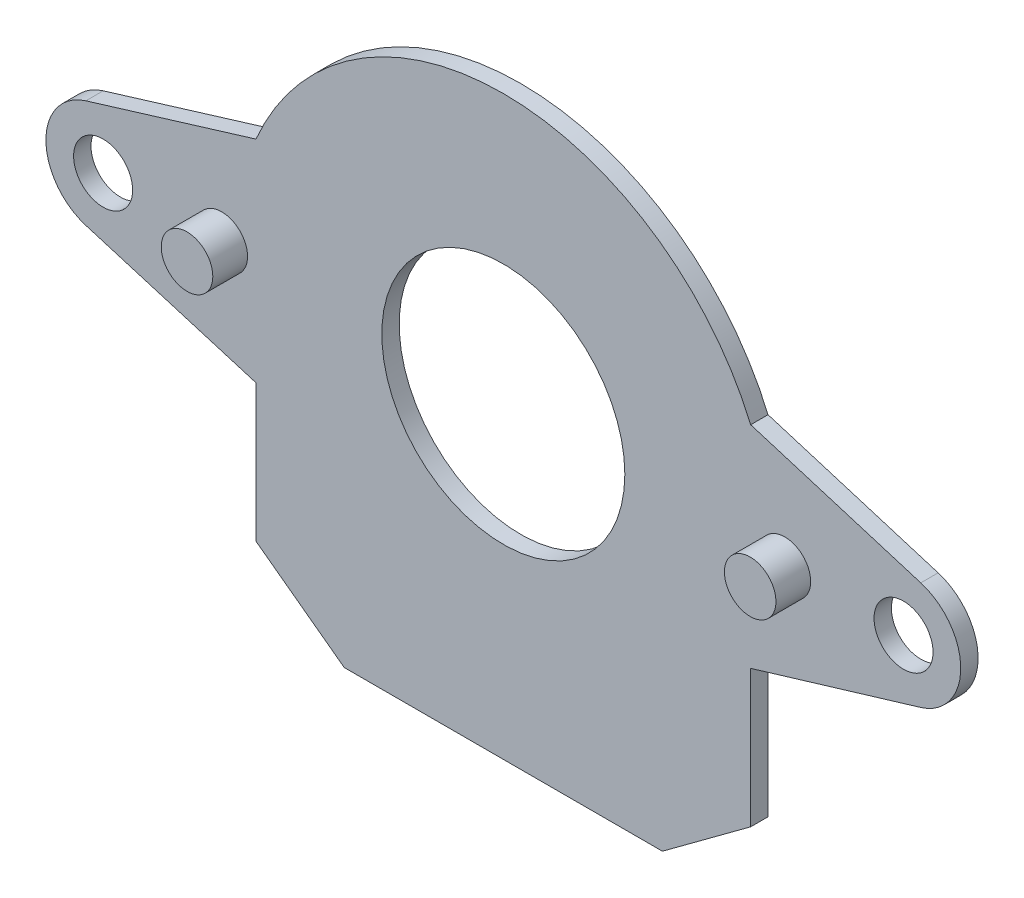
ISO-10303-21;
HEADER;
FILE_DESCRIPTION(('STEP AP214'),'2;1');
FILE_NAME('part.step','',(''),(''),'','','');
FILE_SCHEMA(('AUTOMOTIVE_DESIGN { 1 0 10303 214 1 1 1 1 }'));
ENDSEC;
DATA;
#1=APPLICATION_CONTEXT('core data for automotive mechanical design processes');
#2=APPLICATION_PROTOCOL_DEFINITION('international standard','automotive_design',2000,#1);
#3=PRODUCT_CONTEXT('',#1,'mechanical');
#4=PRODUCT('Part','Part','',(#3));
#5=PRODUCT_RELATED_PRODUCT_CATEGORY('part','',(#4));
#6=PRODUCT_DEFINITION_FORMATION('','',#4);
#7=PRODUCT_DEFINITION_CONTEXT('part definition',#1,'design');
#8=PRODUCT_DEFINITION('design','',#6,#7);
#9=PRODUCT_DEFINITION_SHAPE('','',#8);
#10=(LENGTH_UNIT() NAMED_UNIT(*) SI_UNIT(.MILLI.,.METRE.));
#11=(NAMED_UNIT(*) PLANE_ANGLE_UNIT() SI_UNIT($,.RADIAN.));
#12=(NAMED_UNIT(*) SI_UNIT($,.STERADIAN.) SOLID_ANGLE_UNIT());
#13=UNCERTAINTY_MEASURE_WITH_UNIT(LENGTH_MEASURE(1.E-05),#10,'distance_accuracy_value','');
#14=(GEOMETRIC_REPRESENTATION_CONTEXT(3) GLOBAL_UNCERTAINTY_ASSIGNED_CONTEXT((#13)) GLOBAL_UNIT_ASSIGNED_CONTEXT((#10,
#11,#12)) REPRESENTATION_CONTEXT('',''));
#15=CARTESIAN_POINT('',(0.,0.,0.));
#16=DIRECTION('',(0.,0.,1.));
#17=DIRECTION('',(1.,0.,0.));
#18=AXIS2_PLACEMENT_3D('',#15,#16,#17);
#19=CARTESIAN_POINT('',(0.,0.,1.));
#20=DIRECTION('',(0.,0.,1.));
#21=DIRECTION('',(1.,0.,0.));
#22=AXIS2_PLACEMENT_3D('',#19,#20,#21);
#23=PLANE('',#22);
#24=CARTESIAN_POINT('',(23.055,0.,1.));
#25=DIRECTION('',(0.,0.,1.));
#26=DIRECTION('',(1.,0.,0.));
#27=AXIS2_PLACEMENT_3D('',#24,#25,#26);
#28=CIRCLE('',#27,1.7);
#29=CARTESIAN_POINT('',(24.755,0.,1.));
#30=VERTEX_POINT('',#29);
#31=EDGE_CURVE('E313',#30,#30,#28,.F.);
#32=ORIENTED_EDGE('',*,*,#31,.T.);
#33=EDGE_LOOP('',(#32));
#34=FACE_BOUND('',#33,.T.);
#35=CARTESIAN_POINT('',(16.22,0.,1.));
#36=DIRECTION('',(0.,0.,1.));
#37=DIRECTION('',(1.,0.,0.));
#38=AXIS2_PLACEMENT_3D('',#35,#36,#37);
#39=CIRCLE('',#38,1.485);
#40=CARTESIAN_POINT('',(17.705,0.,1.));
#41=VERTEX_POINT('',#40);
#42=EDGE_CURVE('E11',#41,#41,#39,.T.);
#43=ORIENTED_EDGE('',*,*,#42,.F.);
#44=EDGE_LOOP('',(#43));
#45=FACE_BOUND('',#44,.T.);
#46=CARTESIAN_POINT('',(-16.22,0.,1.));
#47=DIRECTION('',(0.,0.,1.));
#48=DIRECTION('',(1.,0.,0.));
#49=AXIS2_PLACEMENT_3D('',#46,#47,#48);
#50=CIRCLE('',#49,1.485);
#51=CARTESIAN_POINT('',(-14.735,0.,1.));
#52=VERTEX_POINT('',#51);
#53=EDGE_CURVE('E307',#52,#52,#50,.T.);
#54=ORIENTED_EDGE('',*,*,#53,.F.);
#55=EDGE_LOOP('',(#54));
#56=FACE_BOUND('',#55,.T.);
#57=CARTESIAN_POINT('',(0.,0.,1.));
#58=DIRECTION('',(0.,0.,1.));
#59=DIRECTION('',(1.,0.,0.));
#60=AXIS2_PLACEMENT_3D('',#57,#58,#59);
#61=CIRCLE('',#60,7.);
#62=CARTESIAN_POINT('',(7.,0.,1.));
#63=VERTEX_POINT('',#62);
#64=EDGE_CURVE('E190',#63,#63,#61,.T.);
#65=ORIENTED_EDGE('',*,*,#64,.F.);
#66=EDGE_LOOP('',(#65));
#67=FACE_BOUND('',#66,.T.);
#68=DIRECTION('',(1.,0.,0.));
#69=VECTOR('',#68,1.);
#70=CARTESIAN_POINT('',(0.,-17.722,1.));
#71=LINE('',#70,#69);
#72=CARTESIAN_POINT('',(-9.165,-17.722,1.));
#73=VERTEX_POINT('',#72);
#74=CARTESIAN_POINT('',(9.165,-17.722,1.));
#75=VERTEX_POINT('',#74);
#76=EDGE_CURVE('E320',#73,#75,#71,.T.);
#77=ORIENTED_EDGE('',*,*,#76,.T.);
#78=DIRECTION('',(0.804098905396982,0.594495542741387,0.));
#79=VECTOR('',#78,1.);
#80=CARTESIAN_POINT('',(11.7108443093111,-15.8397774472262,1.));
#81=LINE('',#80,#79);
#82=CARTESIAN_POINT('',(14.25,-13.9625,1.));
#83=VERTEX_POINT('',#82);
#84=EDGE_CURVE('E106',#75,#83,#81,.T.);
#85=ORIENTED_EDGE('',*,*,#84,.T.);
#86=DIRECTION('',(0.,1.,0.));
#87=VECTOR('',#86,1.);
#88=CARTESIAN_POINT('',(14.25,0.,1.));
#89=LINE('',#88,#87);
#90=CARTESIAN_POINT('',(14.25,-6.056,1.));
#91=VERTEX_POINT('',#90);
#92=EDGE_CURVE('E233',#83,#91,#89,.T.);
#93=ORIENTED_EDGE('',*,*,#92,.T.);
#94=DIRECTION('',(0.957613222963143,0.288057138786982,0.));
#95=VECTOR('',#94,1.);
#96=CARTESIAN_POINT('',(2.85295244231959,-9.48431618377824,1.));
#97=LINE('',#96,#95);
#98=CARTESIAN_POINT('',(24.0361857010577,-3.11224297463022,1.));
#99=VERTEX_POINT('',#98);
#100=EDGE_CURVE('E229',#91,#99,#97,.T.);
#101=ORIENTED_EDGE('',*,*,#100,.T.);
#102=CARTESIAN_POINT('',(23.1,0.,1.));
#103=DIRECTION('',(0.,0.,1.));
#104=DIRECTION('',(1.,0.,0.));
#105=AXIS2_PLACEMENT_3D('',#102,#103,#104);
#106=CIRCLE('',#105,3.25);
#107=CARTESIAN_POINT('',(24.0484500778805,3.10852737639037,1.));
#108=VERTEX_POINT('',#107);
#109=EDGE_CURVE('E232',#108,#99,#106,.F.);
#110=ORIENTED_EDGE('',*,*,#109,.F.);
#111=DIRECTION('',(-0.956469961966269,0.291830793194008,0.));
#112=VECTOR('',#111,1.);
#113=CARTESIAN_POINT('',(2.91576647175975,9.55637003149481,1.));
#114=LINE('',#113,#112);
#115=CARTESIAN_POINT('',(14.25,6.09815545882523,1.));
#116=VERTEX_POINT('',#115);
#117=EDGE_CURVE('E235',#108,#116,#114,.T.);
#118=ORIENTED_EDGE('',*,*,#117,.T.);
#119=CARTESIAN_POINT('',(0.,0.,1.));
#120=DIRECTION('',(0.,0.,1.));
#121=DIRECTION('',(1.,0.,0.));
#122=AXIS2_PLACEMENT_3D('',#119,#120,#121);
#123=CIRCLE('',#122,15.5);
#124=CARTESIAN_POINT('',(-14.25,6.09815545882523,1.));
#125=VERTEX_POINT('',#124);
#126=EDGE_CURVE('E241',#116,#125,#123,.T.);
#127=ORIENTED_EDGE('',*,*,#126,.T.);
#128=DIRECTION('',(0.956469961966269,0.291830793194008,0.));
#129=VECTOR('',#128,1.);
#130=CARTESIAN_POINT('',(-2.91576647175975,9.55637003149481,1.));
#131=LINE('',#130,#129);
#132=CARTESIAN_POINT('',(-24.0484500778805,3.10852737639037,1.));
#133=VERTEX_POINT('',#132);
#134=EDGE_CURVE('E243',#133,#125,#131,.T.);
#135=ORIENTED_EDGE('',*,*,#134,.F.);
#136=CARTESIAN_POINT('',(-23.1,0.,1.));
#137=DIRECTION('',(0.,0.,1.));
#138=DIRECTION('',(1.,0.,0.));
#139=AXIS2_PLACEMENT_3D('',#136,#137,#138);
#140=CIRCLE('',#139,3.25);
#141=CARTESIAN_POINT('',(-24.0361857010577,-3.11224297463022,1.));
#142=VERTEX_POINT('',#141);
#143=EDGE_CURVE('E149',#133,#142,#140,.T.);
#144=ORIENTED_EDGE('',*,*,#143,.T.);
#145=DIRECTION('',(-0.957613222963143,0.288057138786982,0.));
#146=VECTOR('',#145,1.);
#147=CARTESIAN_POINT('',(-2.85295244231959,-9.48431618377824,1.));
#148=LINE('',#147,#146);
#149=CARTESIAN_POINT('',(-14.25,-6.056,1.));
#150=VERTEX_POINT('',#149);
#151=EDGE_CURVE('E136',#150,#142,#148,.T.);
#152=ORIENTED_EDGE('',*,*,#151,.F.);
#153=DIRECTION('',(0.,1.,0.));
#154=VECTOR('',#153,1.);
#155=CARTESIAN_POINT('',(-14.25,0.,1.));
#156=LINE('',#155,#154);
#157=CARTESIAN_POINT('',(-14.25,-13.9625,1.));
#158=VERTEX_POINT('',#157);
#159=EDGE_CURVE('E146',#158,#150,#156,.T.);
#160=ORIENTED_EDGE('',*,*,#159,.F.);
#161=DIRECTION('',(0.804098905396982,-0.594495542741387,0.));
#162=VECTOR('',#161,1.);
#163=CARTESIAN_POINT('',(-11.7108443093111,-15.8397774472262,1.));
#164=LINE('',#163,#162);
#165=EDGE_CURVE('E54',#158,#73,#164,.T.);
#166=ORIENTED_EDGE('',*,*,#165,.T.);
#167=EDGE_LOOP('',(#77,#85,#93,#101,#110,#118,#127,#135,#144,#152,#160,#166));
#168=FACE_BOUND('',#167,.T.);
#169=CARTESIAN_POINT('',(-23.055,0.,1.));
#170=DIRECTION('',(0.,0.,1.));
#171=DIRECTION('',(1.,0.,0.));
#172=AXIS2_PLACEMENT_3D('',#169,#170,#171);
#173=CIRCLE('',#172,1.7);
#174=CARTESIAN_POINT('',(-21.355,0.,1.));
#175=VERTEX_POINT('',#174);
#176=EDGE_CURVE('E304',#175,#175,#173,.T.);
#177=ORIENTED_EDGE('',*,*,#176,.F.);
#178=EDGE_LOOP('',(#177));
#179=FACE_BOUND('',#178,.T.);
#180=ADVANCED_FACE('F37',(#34,#45,#56,#67,#168,#179),#23,.T.);
#181=CARTESIAN_POINT('',(0.,0.,0.));
#182=DIRECTION('',(0.,0.,1.));
#183=DIRECTION('',(1.,0.,0.));
#184=AXIS2_PLACEMENT_3D('',#181,#182,#183);
#185=PLANE('',#184);
#186=DIRECTION('',(1.,0.,0.));
#187=VECTOR('',#186,1.);
#188=CARTESIAN_POINT('',(0.,-17.722,0.));
#189=LINE('',#188,#187);
#190=CARTESIAN_POINT('',(-9.165,-17.722,0.));
#191=VERTEX_POINT('',#190);
#192=CARTESIAN_POINT('',(9.165,-17.722,0.));
#193=VERTEX_POINT('',#192);
#194=EDGE_CURVE('E161',#191,#193,#189,.T.);
#195=ORIENTED_EDGE('',*,*,#194,.F.);
#196=DIRECTION('',(0.804098905396982,-0.594495542741387,0.));
#197=VECTOR('',#196,1.);
#198=CARTESIAN_POINT('',(-11.7108443093111,-15.8397774472262,0.));
#199=LINE('',#198,#197);
#200=CARTESIAN_POINT('',(-14.25,-13.9625,0.));
#201=VERTEX_POINT('',#200);
#202=EDGE_CURVE('E97',#201,#191,#199,.T.);
#203=ORIENTED_EDGE('',*,*,#202,.F.);
#204=DIRECTION('',(0.,1.,0.));
#205=VECTOR('',#204,1.);
#206=CARTESIAN_POINT('',(-14.25,0.,0.));
#207=LINE('',#206,#205);
#208=CARTESIAN_POINT('',(-14.25,-6.056,0.));
#209=VERTEX_POINT('',#208);
#210=EDGE_CURVE('E187',#201,#209,#207,.T.);
#211=ORIENTED_EDGE('',*,*,#210,.T.);
#212=DIRECTION('',(-0.957613222963143,0.288057138786982,0.));
#213=VECTOR('',#212,1.);
#214=CARTESIAN_POINT('',(-2.85295244231959,-9.48431618377824,0.));
#215=LINE('',#214,#213);
#216=CARTESIAN_POINT('',(-24.0361857010577,-3.11224297463022,0.));
#217=VERTEX_POINT('',#216);
#218=EDGE_CURVE('E138',#209,#217,#215,.T.);
#219=ORIENTED_EDGE('',*,*,#218,.T.);
#220=CARTESIAN_POINT('',(-23.1,0.,0.));
#221=DIRECTION('',(0.,0.,1.));
#222=DIRECTION('',(1.,0.,0.));
#223=AXIS2_PLACEMENT_3D('',#220,#221,#222);
#224=CIRCLE('',#223,3.25);
#225=CARTESIAN_POINT('',(-24.0484500778805,3.10852737639037,0.));
#226=VERTEX_POINT('',#225);
#227=EDGE_CURVE('E183',#226,#217,#224,.T.);
#228=ORIENTED_EDGE('',*,*,#227,.F.);
#229=DIRECTION('',(0.956469961966269,0.291830793194008,0.));
#230=VECTOR('',#229,1.);
#231=CARTESIAN_POINT('',(-2.91576647175975,9.55637003149481,0.));
#232=LINE('',#231,#230);
#233=CARTESIAN_POINT('',(-14.25,6.09815545882523,0.));
#234=VERTEX_POINT('',#233);
#235=EDGE_CURVE('E180',#226,#234,#232,.T.);
#236=ORIENTED_EDGE('',*,*,#235,.T.);
#237=CARTESIAN_POINT('',(0.,0.,0.));
#238=DIRECTION('',(0.,0.,1.));
#239=DIRECTION('',(1.,0.,0.));
#240=AXIS2_PLACEMENT_3D('',#237,#238,#239);
#241=CIRCLE('',#240,15.5);
#242=CARTESIAN_POINT('',(14.25,6.09815545882523,0.));
#243=VERTEX_POINT('',#242);
#244=EDGE_CURVE('E177',#243,#234,#241,.T.);
#245=ORIENTED_EDGE('',*,*,#244,.F.);
#246=DIRECTION('',(-0.956469961966269,0.291830793194008,0.));
#247=VECTOR('',#246,1.);
#248=CARTESIAN_POINT('',(2.91576647175975,9.55637003149481,0.));
#249=LINE('',#248,#247);
#250=CARTESIAN_POINT('',(24.0484500778805,3.10852737639037,0.));
#251=VERTEX_POINT('',#250);
#252=EDGE_CURVE('E175',#251,#243,#249,.T.);
#253=ORIENTED_EDGE('',*,*,#252,.F.);
#254=CARTESIAN_POINT('',(23.1,0.,0.));
#255=DIRECTION('',(0.,0.,1.));
#256=DIRECTION('',(1.,0.,0.));
#257=AXIS2_PLACEMENT_3D('',#254,#255,#256);
#258=CIRCLE('',#257,3.25);
#259=CARTESIAN_POINT('',(24.0361857010577,-3.11224297463022,0.));
#260=VERTEX_POINT('',#259);
#261=EDGE_CURVE('E172',#251,#260,#258,.F.);
#262=ORIENTED_EDGE('',*,*,#261,.T.);
#263=DIRECTION('',(0.957613222963143,0.288057138786982,0.));
#264=VECTOR('',#263,1.);
#265=CARTESIAN_POINT('',(2.85295244231959,-9.48431618377824,0.));
#266=LINE('',#265,#264);
#267=CARTESIAN_POINT('',(14.25,-6.056,0.));
#268=VERTEX_POINT('',#267);
#269=EDGE_CURVE('E169',#268,#260,#266,.T.);
#270=ORIENTED_EDGE('',*,*,#269,.F.);
#271=DIRECTION('',(0.,1.,0.));
#272=VECTOR('',#271,1.);
#273=CARTESIAN_POINT('',(14.25,0.,0.));
#274=LINE('',#273,#272);
#275=CARTESIAN_POINT('',(14.25,-13.9625,0.));
#276=VERTEX_POINT('',#275);
#277=EDGE_CURVE('E167',#276,#268,#274,.T.);
#278=ORIENTED_EDGE('',*,*,#277,.F.);
#279=DIRECTION('',(0.804098905396982,0.594495542741387,0.));
#280=VECTOR('',#279,1.);
#281=CARTESIAN_POINT('',(11.7108443093111,-15.8397774472262,0.));
#282=LINE('',#281,#280);
#283=EDGE_CURVE('E165',#193,#276,#282,.T.);
#284=ORIENTED_EDGE('',*,*,#283,.F.);
#285=EDGE_LOOP('',(#195,#203,#211,#219,#228,#236,#245,#253,#262,#270,#278,#284));
#286=FACE_BOUND('',#285,.T.);
#287=CARTESIAN_POINT('',(0.,0.,0.));
#288=DIRECTION('',(0.,0.,1.));
#289=DIRECTION('',(1.,0.,0.));
#290=AXIS2_PLACEMENT_3D('',#287,#288,#289);
#291=CIRCLE('',#290,7.);
#292=CARTESIAN_POINT('',(7.,0.,0.));
#293=VERTEX_POINT('',#292);
#294=EDGE_CURVE('E158',#293,#293,#291,.T.);
#295=ORIENTED_EDGE('',*,*,#294,.T.);
#296=EDGE_LOOP('',(#295));
#297=FACE_BOUND('',#296,.T.);
#298=CARTESIAN_POINT('',(23.055,0.,0.));
#299=DIRECTION('',(0.,0.,1.));
#300=DIRECTION('',(1.,0.,0.));
#301=AXIS2_PLACEMENT_3D('',#298,#299,#300);
#302=CIRCLE('',#301,1.7);
#303=CARTESIAN_POINT('',(24.755,0.,0.));
#304=VERTEX_POINT('',#303);
#305=EDGE_CURVE('E298',#304,#304,#302,.F.);
#306=ORIENTED_EDGE('',*,*,#305,.F.);
#307=EDGE_LOOP('',(#306));
#308=FACE_BOUND('',#307,.T.);
#309=CARTESIAN_POINT('',(-23.055,0.,0.));
#310=DIRECTION('',(0.,0.,1.));
#311=DIRECTION('',(1.,0.,0.));
#312=AXIS2_PLACEMENT_3D('',#309,#310,#311);
#313=CIRCLE('',#312,1.7);
#314=CARTESIAN_POINT('',(-21.355,0.,0.));
#315=VERTEX_POINT('',#314);
#316=EDGE_CURVE('E301',#315,#315,#313,.T.);
#317=ORIENTED_EDGE('',*,*,#316,.T.);
#318=EDGE_LOOP('',(#317));
#319=FACE_BOUND('',#318,.T.);
#320=ADVANCED_FACE('F217',(#286,#297,#308,#319),#185,.F.);
#321=CARTESIAN_POINT('',(0.,-17.722,1.));
#322=DIRECTION('',(0.,1.,0.));
#323=DIRECTION('',(0.,0.,1.));
#324=AXIS2_PLACEMENT_3D('',#321,#322,#323);
#325=PLANE('',#324);
#326=ORIENTED_EDGE('',*,*,#194,.T.);
#327=DIRECTION('',(0.,0.,-1.));
#328=VECTOR('',#327,1.);
#329=CARTESIAN_POINT('',(9.165,-17.722,1.));
#330=LINE('',#329,#328);
#331=EDGE_CURVE('E46',#75,#193,#330,.T.);
#332=ORIENTED_EDGE('',*,*,#331,.F.);
#333=ORIENTED_EDGE('',*,*,#76,.F.);
#334=DIRECTION('',(0.,0.,-1.));
#335=VECTOR('',#334,1.);
#336=CARTESIAN_POINT('',(-9.165,-17.722,1.));
#337=LINE('',#336,#335);
#338=EDGE_CURVE('E154',#73,#191,#337,.T.);
#339=ORIENTED_EDGE('',*,*,#338,.T.);
#340=EDGE_LOOP('',(#326,#332,#333,#339));
#341=FACE_BOUND('',#340,.T.);
#342=ADVANCED_FACE('F215',(#341),#325,.F.);
#343=CARTESIAN_POINT('',(11.7108443093111,-15.8397774472262,1.));
#344=DIRECTION('',(-0.594495542741387,0.804098905396982,0.));
#345=DIRECTION('',(-0.804098905396982,-0.594495542741387,0.));
#346=AXIS2_PLACEMENT_3D('',#343,#344,#345);
#347=PLANE('',#346);
#348=ORIENTED_EDGE('',*,*,#283,.T.);
#349=DIRECTION('',(0.,0.,-1.));
#350=VECTOR('',#349,1.);
#351=CARTESIAN_POINT('',(14.25,-13.9625,1.));
#352=LINE('',#351,#350);
#353=EDGE_CURVE('E208',#83,#276,#352,.T.);
#354=ORIENTED_EDGE('',*,*,#353,.F.);
#355=ORIENTED_EDGE('',*,*,#84,.F.);
#356=ORIENTED_EDGE('',*,*,#331,.T.);
#357=EDGE_LOOP('',(#348,#354,#355,#356));
#358=FACE_BOUND('',#357,.T.);
#359=ADVANCED_FACE('F211',(#358),#347,.F.);
#360=CARTESIAN_POINT('',(14.25,0.,1.));
#361=DIRECTION('',(-1.,0.,0.));
#362=DIRECTION('',(0.,-1.,0.));
#363=AXIS2_PLACEMENT_3D('',#360,#361,#362);
#364=PLANE('',#363);
#365=ORIENTED_EDGE('',*,*,#277,.T.);
#366=DIRECTION('',(0.,0.,-1.));
#367=VECTOR('',#366,1.);
#368=CARTESIAN_POINT('',(14.25,-6.056,1.));
#369=LINE('',#368,#367);
#370=EDGE_CURVE('E205',#91,#268,#369,.T.);
#371=ORIENTED_EDGE('',*,*,#370,.F.);
#372=ORIENTED_EDGE('',*,*,#92,.F.);
#373=ORIENTED_EDGE('',*,*,#353,.T.);
#374=EDGE_LOOP('',(#365,#371,#372,#373));
#375=FACE_BOUND('',#374,.T.);
#376=ADVANCED_FACE('F223',(#375),#364,.F.);
#377=CARTESIAN_POINT('',(2.85295244231959,-9.48431618377824,1.));
#378=DIRECTION('',(-0.288057138786982,0.957613222963143,0.));
#379=DIRECTION('',(-0.957613222963143,-0.288057138786982,0.));
#380=AXIS2_PLACEMENT_3D('',#377,#378,#379);
#381=PLANE('',#380);
#382=ORIENTED_EDGE('',*,*,#269,.T.);
#383=DIRECTION('',(0.,0.,-1.));
#384=VECTOR('',#383,1.);
#385=CARTESIAN_POINT('',(24.0361857010577,-3.11224297463022,1.));
#386=LINE('',#385,#384);
#387=EDGE_CURVE('E203',#99,#260,#386,.T.);
#388=ORIENTED_EDGE('',*,*,#387,.F.);
#389=ORIENTED_EDGE('',*,*,#100,.F.);
#390=ORIENTED_EDGE('',*,*,#370,.T.);
#391=EDGE_LOOP('',(#382,#388,#389,#390));
#392=FACE_BOUND('',#391,.T.);
#393=ADVANCED_FACE('F227',(#392),#381,.F.);
#394=CARTESIAN_POINT('',(23.1,0.,1.));
#395=DIRECTION('',(0.,0.,-1.));
#396=DIRECTION('',(-1.,0.,0.));
#397=AXIS2_PLACEMENT_3D('',#394,#395,#396);
#398=CYLINDRICAL_SURFACE('',#397,3.25);
#399=ORIENTED_EDGE('',*,*,#261,.F.);
#400=DIRECTION('',(0.,0.,-1.));
#401=VECTOR('',#400,1.);
#402=CARTESIAN_POINT('',(24.0484500778805,3.10852737639037,1.));
#403=LINE('',#402,#401);
#404=EDGE_CURVE('E201',#108,#251,#403,.T.);
#405=ORIENTED_EDGE('',*,*,#404,.F.);
#406=ORIENTED_EDGE('',*,*,#109,.T.);
#407=ORIENTED_EDGE('',*,*,#387,.T.);
#408=EDGE_LOOP('',(#399,#405,#406,#407));
#409=FACE_BOUND('',#408,.T.);
#410=ADVANCED_FACE('F423',(#409),#398,.T.);
#411=CARTESIAN_POINT('',(2.91576647175975,9.55637003149481,1.));
#412=DIRECTION('',(-0.291830793194008,-0.956469961966269,0.));
#413=DIRECTION('',(0.956469961966269,-0.291830793194008,0.));
#414=AXIS2_PLACEMENT_3D('',#411,#412,#413);
#415=PLANE('',#414);
#416=ORIENTED_EDGE('',*,*,#252,.T.);
#417=DIRECTION('',(0.,0.,-1.));
#418=VECTOR('',#417,1.);
#419=CARTESIAN_POINT('',(14.25,6.09815545882523,1.));
#420=LINE('',#419,#418);
#421=EDGE_CURVE('E198',#116,#243,#420,.T.);
#422=ORIENTED_EDGE('',*,*,#421,.F.);
#423=ORIENTED_EDGE('',*,*,#117,.F.);
#424=ORIENTED_EDGE('',*,*,#404,.T.);
#425=EDGE_LOOP('',(#416,#422,#423,#424));
#426=FACE_BOUND('',#425,.T.);
#427=ADVANCED_FACE('F414',(#426),#415,.F.);
#428=CARTESIAN_POINT('',(0.,0.,1.));
#429=DIRECTION('',(0.,0.,-1.));
#430=DIRECTION('',(-1.,0.,0.));
#431=AXIS2_PLACEMENT_3D('',#428,#429,#430);
#432=CYLINDRICAL_SURFACE('',#431,15.5);
#433=ORIENTED_EDGE('',*,*,#244,.T.);
#434=DIRECTION('',(0.,0.,-1.));
#435=VECTOR('',#434,1.);
#436=CARTESIAN_POINT('',(-14.25,6.09815545882523,1.));
#437=LINE('',#436,#435);
#438=EDGE_CURVE('E196',#125,#234,#437,.T.);
#439=ORIENTED_EDGE('',*,*,#438,.F.);
#440=ORIENTED_EDGE('',*,*,#126,.F.);
#441=ORIENTED_EDGE('',*,*,#421,.T.);
#442=EDGE_LOOP('',(#433,#439,#440,#441));
#443=FACE_BOUND('',#442,.T.);
#444=ADVANCED_FACE('F253',(#443),#432,.T.);
#445=CARTESIAN_POINT('',(-2.91576647175975,9.55637003149481,1.));
#446=DIRECTION('',(-0.291830793194008,0.956469961966269,0.));
#447=DIRECTION('',(-0.956469961966269,-0.291830793194008,0.));
#448=AXIS2_PLACEMENT_3D('',#445,#446,#447);
#449=PLANE('',#448);
#450=ORIENTED_EDGE('',*,*,#235,.F.);
#451=DIRECTION('',(0.,0.,-1.));
#452=VECTOR('',#451,1.);
#453=CARTESIAN_POINT('',(-24.0484500778805,3.10852737639037,1.));
#454=LINE('',#453,#452);
#455=EDGE_CURVE('E194',#133,#226,#454,.T.);
#456=ORIENTED_EDGE('',*,*,#455,.F.);
#457=ORIENTED_EDGE('',*,*,#134,.T.);
#458=ORIENTED_EDGE('',*,*,#438,.T.);
#459=EDGE_LOOP('',(#450,#456,#457,#458));
#460=FACE_BOUND('',#459,.T.);
#461=ADVANCED_FACE('F247',(#460),#449,.T.);
#462=CARTESIAN_POINT('',(-23.1,0.,1.));
#463=DIRECTION('',(0.,0.,-1.));
#464=DIRECTION('',(-1.,0.,0.));
#465=AXIS2_PLACEMENT_3D('',#462,#463,#464);
#466=CYLINDRICAL_SURFACE('',#465,3.25);
#467=ORIENTED_EDGE('',*,*,#227,.T.);
#468=DIRECTION('',(0.,0.,-1.));
#469=VECTOR('',#468,1.);
#470=CARTESIAN_POINT('',(-24.0361857010577,-3.11224297463022,1.));
#471=LINE('',#470,#469);
#472=EDGE_CURVE('E143',#142,#217,#471,.T.);
#473=ORIENTED_EDGE('',*,*,#472,.F.);
#474=ORIENTED_EDGE('',*,*,#143,.F.);
#475=ORIENTED_EDGE('',*,*,#455,.T.);
#476=EDGE_LOOP('',(#467,#473,#474,#475));
#477=FACE_BOUND('',#476,.T.);
#478=ADVANCED_FACE('F258',(#477),#466,.T.);
#479=CARTESIAN_POINT('',(-2.85295244231959,-9.48431618377824,1.));
#480=DIRECTION('',(-0.288057138786982,-0.957613222963143,0.));
#481=DIRECTION('',(0.957613222963143,-0.288057138786982,0.));
#482=AXIS2_PLACEMENT_3D('',#479,#480,#481);
#483=PLANE('',#482);
#484=ORIENTED_EDGE('',*,*,#218,.F.);
#485=DIRECTION('',(0.,0.,-1.));
#486=VECTOR('',#485,1.);
#487=CARTESIAN_POINT('',(-14.25,-6.056,1.));
#488=LINE('',#487,#486);
#489=EDGE_CURVE('E133',#150,#209,#488,.T.);
#490=ORIENTED_EDGE('',*,*,#489,.F.);
#491=ORIENTED_EDGE('',*,*,#151,.T.);
#492=ORIENTED_EDGE('',*,*,#472,.T.);
#493=EDGE_LOOP('',(#484,#490,#491,#492));
#494=FACE_BOUND('',#493,.T.);
#495=ADVANCED_FACE('F135',(#494),#483,.T.);
#496=CARTESIAN_POINT('',(-14.25,0.,1.));
#497=DIRECTION('',(-1.,0.,0.));
#498=DIRECTION('',(0.,0.,1.));
#499=AXIS2_PLACEMENT_3D('',#496,#497,#498);
#500=PLANE('',#499);
#501=ORIENTED_EDGE('',*,*,#210,.F.);
#502=DIRECTION('',(0.,0.,-1.));
#503=VECTOR('',#502,1.);
#504=CARTESIAN_POINT('',(-14.25,-13.9625,1.));
#505=LINE('',#504,#503);
#506=EDGE_CURVE('E94',#158,#201,#505,.T.);
#507=ORIENTED_EDGE('',*,*,#506,.F.);
#508=ORIENTED_EDGE('',*,*,#159,.T.);
#509=ORIENTED_EDGE('',*,*,#489,.T.);
#510=EDGE_LOOP('',(#501,#507,#508,#509));
#511=FACE_BOUND('',#510,.T.);
#512=ADVANCED_FACE('F152',(#511),#500,.T.);
#513=CARTESIAN_POINT('',(0.,0.,1.));
#514=DIRECTION('',(0.,0.,-1.));
#515=DIRECTION('',(-1.,0.,0.));
#516=AXIS2_PLACEMENT_3D('',#513,#514,#515);
#517=CYLINDRICAL_SURFACE('',#516,7.);
#518=ORIENTED_EDGE('',*,*,#64,.T.);
#519=EDGE_LOOP('',(#518));
#520=FACE_BOUND('',#519,.T.);
#521=ORIENTED_EDGE('',*,*,#294,.F.);
#522=EDGE_LOOP('',(#521));
#523=FACE_BOUND('',#522,.T.);
#524=ADVANCED_FACE('F39',(#520,#523),#517,.F.);
#525=CARTESIAN_POINT('',(-11.7108443093111,-15.8397774472262,1.));
#526=DIRECTION('',(0.594495542741387,0.804098905396982,0.));
#527=DIRECTION('',(-0.804098905396982,0.594495542741387,0.));
#528=AXIS2_PLACEMENT_3D('',#525,#526,#527);
#529=PLANE('',#528);
#530=ORIENTED_EDGE('',*,*,#202,.T.);
#531=ORIENTED_EDGE('',*,*,#338,.F.);
#532=ORIENTED_EDGE('',*,*,#165,.F.);
#533=ORIENTED_EDGE('',*,*,#506,.T.);
#534=EDGE_LOOP('',(#530,#531,#532,#533));
#535=FACE_BOUND('',#534,.T.);
#536=ADVANCED_FACE('F280',(#535),#529,.F.);
#537=CARTESIAN_POINT('',(-16.22,0.,3.));
#538=DIRECTION('',(0.,0.,-1.));
#539=DIRECTION('',(-1.,0.,0.));
#540=AXIS2_PLACEMENT_3D('',#537,#538,#539);
#541=CYLINDRICAL_SURFACE('',#540,1.485);
#542=CARTESIAN_POINT('',(-16.22,0.,3.));
#543=DIRECTION('',(0.,0.,1.));
#544=DIRECTION('',(1.,0.,0.));
#545=AXIS2_PLACEMENT_3D('',#542,#543,#544);
#546=CIRCLE('',#545,1.485);
#547=CARTESIAN_POINT('',(-14.735,0.,3.));
#548=VERTEX_POINT('',#547);
#549=EDGE_CURVE('E162',#548,#548,#546,.T.);
#550=ORIENTED_EDGE('',*,*,#549,.F.);
#551=EDGE_LOOP('',(#550));
#552=FACE_BOUND('',#551,.T.);
#553=ORIENTED_EDGE('',*,*,#53,.T.);
#554=EDGE_LOOP('',(#553));
#555=FACE_BOUND('',#554,.T.);
#556=ADVANCED_FACE('F277',(#552,#555),#541,.T.);
#557=CARTESIAN_POINT('',(0.,0.,3.));
#558=DIRECTION('',(0.,0.,1.));
#559=DIRECTION('',(1.,0.,0.));
#560=AXIS2_PLACEMENT_3D('',#557,#558,#559);
#561=PLANE('',#560);
#562=ORIENTED_EDGE('',*,*,#549,.T.);
#563=EDGE_LOOP('',(#562));
#564=FACE_BOUND('',#563,.T.);
#565=ADVANCED_FACE('F326',(#564),#561,.T.);
#566=CARTESIAN_POINT('',(16.22,0.,3.));
#567=DIRECTION('',(0.,0.,-1.));
#568=DIRECTION('',(-1.,0.,0.));
#569=AXIS2_PLACEMENT_3D('',#566,#567,#568);
#570=CYLINDRICAL_SURFACE('',#569,1.485);
#571=CARTESIAN_POINT('',(16.22,0.,3.));
#572=DIRECTION('',(0.,0.,-1.));
#573=DIRECTION('',(-1.,0.,0.));
#574=AXIS2_PLACEMENT_3D('',#571,#572,#573);
#575=CIRCLE('',#574,1.485);
#576=CARTESIAN_POINT('',(14.735,0.,3.));
#577=VERTEX_POINT('',#576);
#578=EDGE_CURVE('E303',#577,#577,#575,.T.);
#579=ORIENTED_EDGE('',*,*,#578,.T.);
#580=EDGE_LOOP('',(#579));
#581=FACE_BOUND('',#580,.T.);
#582=ORIENTED_EDGE('',*,*,#42,.T.);
#583=EDGE_LOOP('',(#582));
#584=FACE_BOUND('',#583,.T.);
#585=ADVANCED_FACE('F331',(#581,#584),#570,.T.);
#586=CARTESIAN_POINT('',(16.22,0.,3.));
#587=DIRECTION('',(0.,0.,-1.));
#588=DIRECTION('',(-1.,0.,0.));
#589=AXIS2_PLACEMENT_3D('',#586,#587,#588);
#590=PLANE('',#589);
#591=ORIENTED_EDGE('',*,*,#578,.F.);
#592=EDGE_LOOP('',(#591));
#593=FACE_BOUND('',#592,.T.);
#594=ADVANCED_FACE('F337',(#593),#590,.F.);
#595=CARTESIAN_POINT('',(23.055,0.,0.));
#596=DIRECTION('',(0.,0.,1.));
#597=DIRECTION('',(1.,0.,0.));
#598=AXIS2_PLACEMENT_3D('',#595,#596,#597);
#599=CYLINDRICAL_SURFACE('',#598,1.7);
#600=ORIENTED_EDGE('',*,*,#305,.T.);
#601=EDGE_LOOP('',(#600));
#602=FACE_BOUND('',#601,.T.);
#603=ORIENTED_EDGE('',*,*,#31,.F.);
#604=EDGE_LOOP('',(#603));
#605=FACE_BOUND('',#604,.T.);
#606=ADVANCED_FACE('F342',(#602,#605),#599,.F.);
#607=CARTESIAN_POINT('',(-23.055,0.,0.));
#608=DIRECTION('',(0.,0.,1.));
#609=DIRECTION('',(1.,0.,0.));
#610=AXIS2_PLACEMENT_3D('',#607,#608,#609);
#611=CYLINDRICAL_SURFACE('',#610,1.7);
#612=ORIENTED_EDGE('',*,*,#316,.F.);
#613=EDGE_LOOP('',(#612));
#614=FACE_BOUND('',#613,.T.);
#615=ORIENTED_EDGE('',*,*,#176,.T.);
#616=EDGE_LOOP('',(#615));
#617=FACE_BOUND('',#616,.T.);
#618=ADVANCED_FACE('F347',(#614,#617),#611,.F.);
#619=CLOSED_SHELL('',(#180,#320,#342,#359,#376,#393,#410,#427,#444,#461,#478,#495,#512,#524,
#536,#556,#565,#585,#594,#606,#618));
#620=MANIFOLD_SOLID_BREP('B2',#619);
#621=ADVANCED_BREP_SHAPE_REPRESENTATION('',(#18,#620),#14);
#622=SHAPE_DEFINITION_REPRESENTATION(#9,#621);
ENDSEC;
END-ISO-10303-21;
